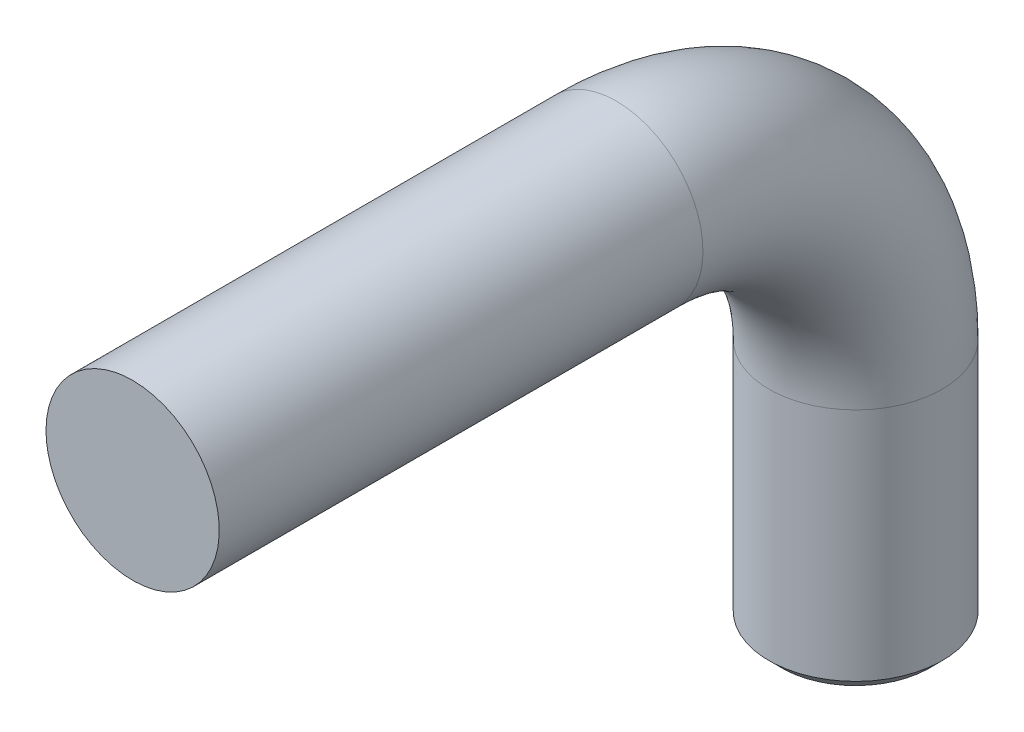
ISO-10303-21;
HEADER;
FILE_DESCRIPTION(('STEP AP214'),'2;1');
FILE_NAME('part.step','',(''),(''),'','','');
FILE_SCHEMA(('AUTOMOTIVE_DESIGN { 1 0 10303 214 1 1 1 1 }'));
ENDSEC;
DATA;
#1=APPLICATION_CONTEXT('core data for automotive mechanical design processes');
#2=APPLICATION_PROTOCOL_DEFINITION('international standard','automotive_design',2000,#1);
#3=PRODUCT_CONTEXT('',#1,'mechanical');
#4=PRODUCT('Part','Part','',(#3));
#5=PRODUCT_RELATED_PRODUCT_CATEGORY('part','',(#4));
#6=PRODUCT_DEFINITION_FORMATION('','',#4);
#7=PRODUCT_DEFINITION_CONTEXT('part definition',#1,'design');
#8=PRODUCT_DEFINITION('design','',#6,#7);
#9=PRODUCT_DEFINITION_SHAPE('','',#8);
#10=(LENGTH_UNIT() NAMED_UNIT(*) SI_UNIT(.MILLI.,.METRE.));
#11=(NAMED_UNIT(*) PLANE_ANGLE_UNIT() SI_UNIT($,.RADIAN.));
#12=(NAMED_UNIT(*) SI_UNIT($,.STERADIAN.) SOLID_ANGLE_UNIT());
#13=UNCERTAINTY_MEASURE_WITH_UNIT(LENGTH_MEASURE(1.E-05),#10,'distance_accuracy_value','');
#14=(GEOMETRIC_REPRESENTATION_CONTEXT(3) GLOBAL_UNCERTAINTY_ASSIGNED_CONTEXT((#13)) GLOBAL_UNIT_ASSIGNED_CONTEXT((#10,
#11,#12)) REPRESENTATION_CONTEXT('',''));
#15=CARTESIAN_POINT('',(0.,0.,0.));
#16=DIRECTION('',(0.,0.,1.));
#17=DIRECTION('',(1.,0.,0.));
#18=AXIS2_PLACEMENT_3D('',#15,#16,#17);
#19=CARTESIAN_POINT('',(-6.072,-39.336531538,-52.354709774));
#20=DIRECTION('',(0.,1.,0.));
#21=DIRECTION('',(0.,0.,-1.));
#22=AXIS2_PLACEMENT_3D('',#19,#20,#21);
#23=PLANE('',#22);
#24=CARTESIAN_POINT('',(0.,-39.336531538,-58.426709774));
#25=DIRECTION('',(0.,-1.,0.));
#26=DIRECTION('',(0.,0.,-1.));
#27=AXIS2_PLACEMENT_3D('',#24,#25,#26);
#28=CIRCLE('',#27,6.);
#29=CARTESIAN_POINT('',(0.,-39.336531538,-64.426709774));
#30=VERTEX_POINT('',#29);
#31=EDGE_CURVE('E56',#30,#30,#28,.F.);
#32=ORIENTED_EDGE('',*,*,#31,.F.);
#33=EDGE_LOOP('',(#32));
#34=FACE_BOUND('',#33,.T.);
#35=ADVANCED_FACE('F51',(#34),#23,.F.);
#36=CARTESIAN_POINT('',(0.,-39.336531538,-64.426709774));
#37=CARTESIAN_POINT('',(0.,-38.336531538,-65.426709774));
#38=(BOUNDED_CURVE() B_SPLINE_CURVE(1,(#36,#37),.UNSPECIFIED.,.F.,
.F.) B_SPLINE_CURVE_WITH_KNOTS((2,2),(0.,0.999999999999972),
.UNSPECIFIED.) CURVE() GEOMETRIC_REPRESENTATION_ITEM() RATIONAL_B_SPLINE_CURVE((1.,1.)) REPRESENTATION_ITEM(''));
#39=CARTESIAN_POINT('',(0.,-1038.336531539,-58.426709774));
#40=DIRECTION('',(0.,1.,0.));
#41=AXIS1_PLACEMENT('',#39,#40);
#42=SURFACE_OF_REVOLUTION('',#38,#41);
#43=ORIENTED_EDGE('',*,*,#31,.T.);
#44=EDGE_LOOP('',(#43));
#45=FACE_BOUND('',#44,.T.);
#46=CARTESIAN_POINT('',(0.,-38.336531538,-58.426709774));
#47=DIRECTION('',(0.,-1.,0.));
#48=DIRECTION('',(0.,0.,-1.));
#49=AXIS2_PLACEMENT_3D('',#46,#47,#48);
#50=CIRCLE('',#49,7.);
#51=CARTESIAN_POINT('',(0.,-38.336531538,-65.426709774));
#52=VERTEX_POINT('',#51);
#53=EDGE_CURVE('E116',#52,#52,#50,.F.);
#54=ORIENTED_EDGE('',*,*,#53,.F.);
#55=EDGE_LOOP('',(#54));
#56=FACE_BOUND('',#55,.T.);
#57=ADVANCED_FACE('F99',(#45,#56),#42,.T.);
#58=CARTESIAN_POINT('',(0.,-19.336531538,-51.426709774));
#59=CARTESIAN_POINT('',(0.,-38.336531538,-51.426709774));
#60=(BOUNDED_CURVE() B_SPLINE_CURVE(1,(#58,#59),.UNSPECIFIED.,.F.,
.F.) B_SPLINE_CURVE_WITH_KNOTS((2,2),(0.,1.),
.UNSPECIFIED.) CURVE() GEOMETRIC_REPRESENTATION_ITEM() RATIONAL_B_SPLINE_CURVE((1.,1.)) REPRESENTATION_ITEM(''));
#61=CARTESIAN_POINT('',(0.,-19.336531538,-58.426709774));
#62=DIRECTION('',(0.,-1.,0.));
#63=AXIS1_PLACEMENT('',#61,#62);
#64=SURFACE_OF_REVOLUTION('',#60,#63);
#65=CARTESIAN_POINT('',(0.,-19.336531538,-58.426709774));
#66=DIRECTION('',(0.,-1.,0.));
#67=DIRECTION('',(0.,0.,-1.));
#68=AXIS2_PLACEMENT_3D('',#65,#66,#67);
#69=CIRCLE('',#68,7.);
#70=CARTESIAN_POINT('',(0.,-19.3365315380001,-65.426709774));
#71=VERTEX_POINT('',#70);
#72=EDGE_CURVE('E65',#71,#71,#69,.T.);
#73=ORIENTED_EDGE('',*,*,#72,.T.);
#74=EDGE_LOOP('',(#73));
#75=FACE_BOUND('',#74,.T.);
#76=ORIENTED_EDGE('',*,*,#53,.T.);
#77=EDGE_LOOP('',(#76));
#78=FACE_BOUND('',#77,.T.);
#79=ADVANCED_FACE('F83',(#75,#78),#64,.T.);
#80=CARTESIAN_POINT('',(0.,-19.3365315379999,-39.090178236));
#81=DIRECTION('',(1.,0.,0.));
#82=DIRECTION('',(0.,0.,1.));
#83=AXIS2_PLACEMENT_3D('',#80,#81,#82);
#84=TOROIDAL_SURFACE('',#83,19.3365315379999,7.);
#85=CARTESIAN_POINT('',(0.,0.,-39.090178236));
#86=DIRECTION('',(0.,0.,-1.));
#87=DIRECTION('',(0.,1.,0.));
#88=AXIS2_PLACEMENT_3D('',#85,#86,#87);
#89=CIRCLE('',#88,7.);
#90=CARTESIAN_POINT('',(0.,7.,-39.090178236));
#91=VERTEX_POINT('',#90);
#92=EDGE_CURVE('E60',#91,#91,#89,.F.);
#93=CARTESIAN_POINT('',(0.,-19.3365315379999,-39.090178236));
#94=DIRECTION('',(1.,0.,0.));
#95=DIRECTION('',(0.,0.,1.));
#96=AXIS2_PLACEMENT_3D('',#93,#94,#95);
#97=CIRCLE('',#96,26.3365315379999);
#98=EDGE_CURVE('',#71,#91,#97,.T.);
#99=ORIENTED_EDGE('',*,*,#72,.F.);
#100=ORIENTED_EDGE('',*,*,#92,.F.);
#101=ORIENTED_EDGE('',*,*,#98,.T.);
#102=ORIENTED_EDGE('',*,*,#98,.F.);
#103=EDGE_LOOP('',(#99,#101,#100,#102));
#104=FACE_BOUND('',#103,.T.);
#105=ADVANCED_FACE('F98',(#104),#84,.T.);
#106=CARTESIAN_POINT('',(7.084,-7.084,0.));
#107=DIRECTION('',(0.,0.,1.));
#108=DIRECTION('',(-1.,0.,0.));
#109=AXIS2_PLACEMENT_3D('',#106,#107,#108);
#110=PLANE('',#109);
#111=CARTESIAN_POINT('',(-7.,-1.91429941660033E-09,0.));
#112=CARTESIAN_POINT('',(-6.99999891509851,0.196537843364104,0.));
#113=CARTESIAN_POINT('',(-6.99171583277586,0.393111316923906,0.));
#114=CARTESIAN_POINT('',(-6.95863478243086,0.784902996405907,0.));
#115=CARTESIAN_POINT('',(-6.93383193869678,0.980120785012645,0.));
#116=CARTESIAN_POINT('',(-6.86783123658557,1.368089954953,0.));
#117=CARTESIAN_POINT('',(-6.82660735302091,1.56083691741882,0.));
#118=CARTESIAN_POINT('',(-6.7280179483323,1.94232350827592,0.));
#119=CARTESIAN_POINT('',(-6.67063932812044,2.13105975044892,0.));
#120=CARTESIAN_POINT('',(-6.54027609809834,2.50269830515233,0.));
#121=CARTESIAN_POINT('',(-6.46731852835665,2.68561010287559,0.));
#122=CARTESIAN_POINT('',(-6.30622093211251,3.04472057343403,0.));
#123=CARTESIAN_POINT('',(-6.21807404509193,3.22091616867288,0.));
#124=CARTESIAN_POINT('',(-6.02724393962142,3.56526003396931,0.));
#125=CARTESIAN_POINT('',(-5.92456017435632,3.73340800099105,0.));
#126=CARTESIAN_POINT('',(-5.70543879336831,4.06037952617178,0.));
#127=CARTESIAN_POINT('',(-5.58900741164614,4.2192072621471,0.));
#128=CARTESIAN_POINT('',(-5.3431015333083,4.52659138815728,0.));
#129=CARTESIAN_POINT('',(-5.21361865727475,4.67514107487068,0.));
#130=CARTESIAN_POINT('',(-4.94272477354184,4.96066133858248,0.));
#131=CARTESIAN_POINT('',(-4.80132538672348,5.09764294149686,0.));
#132=CARTESIAN_POINT('',(-4.50742847418091,5.35927350480671,0.));
#133=CARTESIAN_POINT('',(-4.35492595010818,5.48391685050972,0.));
#134=CARTESIAN_POINT('',(-4.03992693399899,5.71994163914791,0.));
#135=CARTESIAN_POINT('',(-3.87742813542729,5.83132000379004,0.));
#136=CARTESIAN_POINT('',(-3.54368055722161,6.0399539706526,0.));
#137=CARTESIAN_POINT('',(-3.37243475130826,6.13721432993625,0.));
#138=CARTESIAN_POINT('',(-3.02229506377335,6.31699903732685,0.));
#139=CARTESIAN_POINT('',(-2.84339838718572,6.39951794219541,0.));
#140=CARTESIAN_POINT('',(-2.47935795885249,6.54916017127648,0.));
#141=CARTESIAN_POINT('',(-2.29421661919292,6.61628936359377,0.));
#142=CARTESIAN_POINT('',(-1.91886742245351,6.73473767043591,0.));
#143=CARTESIAN_POINT('',(-1.72865769506266,6.78605085832031,0.));
#144=CARTESIAN_POINT('',(-1.3446696181136,6.87245049550629,0.));
#145=CARTESIAN_POINT('',(-1.15089275696516,6.90754356003006,0.));
#146=CARTESIAN_POINT('',(-0.760983453149632,6.96129667140605,0.));
#147=CARTESIAN_POINT('',(-0.564849982830857,6.97994926434688,0.));
#148=CARTESIAN_POINT('',(-0.171708861072429,7.0006616332308,0.));
#149=CARTESIAN_POINT('',(0.0252987903672232,7.00272140917389,0.));
#150=CARTESIAN_POINT('',(0.418697806180248,6.99023635643656,0.));
#151=CARTESIAN_POINT('',(0.61508940928194,6.97569904838587,0.));
#152=CARTESIAN_POINT('',(1.00603037545228,6.93012601343414,0.));
#153=CARTESIAN_POINT('',(1.20057895345833,6.89908355153457,0.));
#154=CARTESIAN_POINT('',(1.58629644040987,6.82073151807987,0.));
#155=CARTESIAN_POINT('',(1.77746658655911,6.77342803688245,0.));
#156=CARTESIAN_POINT('',(2.15521567208457,6.66286647679002,0.));
#157=CARTESIAN_POINT('',(2.3417928293305,6.59960230882084,0.));
#158=CARTESIAN_POINT('',(2.70888540741974,6.4576044887307,0.));
#159=CARTESIAN_POINT('',(2.88940303579749,6.37887654340142,0.));
#160=CARTESIAN_POINT('',(3.24322564239428,6.20646673756665,0.));
#161=CARTESIAN_POINT('',(3.41652816321271,6.11277983386306,0.));
#162=CARTESIAN_POINT('',(3.75458414244703,5.91116079729822,0.));
#163=CARTESIAN_POINT('',(3.9193395711717,5.8032319680526,0.));
#164=CARTESIAN_POINT('',(4.23910084322866,5.57393156301064,0.));
#165=CARTESIAN_POINT('',(4.39411106726421,5.45256609603564,0.));
#166=CARTESIAN_POINT('',(4.69350691037047,5.19709115330211,0.));
#167=CARTESIAN_POINT('',(4.83788213146208,5.06296949157914,0.));
#168=CARTESIAN_POINT('',(5.11472568875869,4.78312605908963,0.));
#169=CARTESIAN_POINT('',(5.24720165362922,4.63741183501937,0.));
#170=CARTESIAN_POINT('',(5.49946717453756,4.33527500368971,0.));
#171=CARTESIAN_POINT('',(5.61925097007774,4.17884758669209,0.));
#172=CARTESIAN_POINT('',(5.84520726613122,3.8564618255379,0.));
#173=CARTESIAN_POINT('',(5.95138027859047,3.69050384019726,0.));
#174=CARTESIAN_POINT('',(6.14932029190583,3.35030901850081,0.));
#175=CARTESIAN_POINT('',(6.24109379191638,3.17607596358646,0.));
#176=CARTESIAN_POINT('',(6.40978599467957,2.82019293812676,0.));
#177=CARTESIAN_POINT('',(6.48667880373029,2.63853069360937,0.));
#178=CARTESIAN_POINT('',(6.62480787986965,2.26951545267121,0.));
#179=CARTESIAN_POINT('',(6.68605681771731,2.08216720013533,0.));
#180=CARTESIAN_POINT('',(6.79245876905863,1.70328094510092,0.));
#181=CARTESIAN_POINT('',(6.8376371993455,1.51175007165545,0.));
#182=CARTESIAN_POINT('',(6.91170339676888,1.12560337103086,0.));
#183=CARTESIAN_POINT('',(6.94059596877539,0.930988471181961,0.));
#184=CARTESIAN_POINT('',(6.97415548049398,0.613393017569112,0.));
#185=CARTESIAN_POINT('',(6.98384414946197,0.490921235047914,0.));
#186=CARTESIAN_POINT('',(6.99676674823848,0.245637606525264,0.));
#187=CARTESIAN_POINT('',(7.00000067804701,0.122825760523812,0.));
#188=CARTESIAN_POINT('',(6.999998915033,-0.196537845698365,0.));
#189=CARTESIAN_POINT('',(6.99171583264476,-0.393111319255953,0.));
#190=CARTESIAN_POINT('',(6.95863478216895,-0.784902998727887,0.));
#191=CARTESIAN_POINT('',(6.93383193836967,-0.980120787326772,0.));
#192=CARTESIAN_POINT('',(6.867831236129,-1.36808995724492,0.));
#193=CARTESIAN_POINT('',(6.82660735250015,-1.56083691969639,0.));
#194=CARTESIAN_POINT('',(6.72801794768457,-1.94232351051955,0.));
#195=CARTESIAN_POINT('',(6.67063932740992,-2.13105975267294,0.));
#196=CARTESIAN_POINT('',(6.5402760972641,-2.50269830733243,0.));
#197=CARTESIAN_POINT('',(6.46731852746144,-2.68561010503139,0.));
#198=CARTESIAN_POINT('',(6.30622093109758,-3.04472057553615,0.));
#199=CARTESIAN_POINT('',(6.21807404401826,-3.22091617074562,0.));
#200=CARTESIAN_POINT('',(6.02724393843297,-3.56526003597845,0.));
#201=CARTESIAN_POINT('',(5.92456017311182,-3.73340800296595,0.));
#202=CARTESIAN_POINT('',(5.70543879201484,-4.06037952807361,0.));
#203=CARTESIAN_POINT('',(5.58900741023973,-4.21920726401011,0.));
#204=CARTESIAN_POINT('',(5.34310153179942,-4.52659138993833,0.));
#205=CARTESIAN_POINT('',(5.21361865571633,-4.6751410766086,0.));
#206=CARTESIAN_POINT('',(4.9427247718882,-4.96066134023014,0.));
#207=CARTESIAN_POINT('',(4.80132538502416,-5.09764294309741,0.));
#208=CARTESIAN_POINT('',(4.50742847239436,-5.35927350630929,0.));
#209=CARTESIAN_POINT('',(4.35492594828011,-5.48391685196144,0.));
#210=CARTESIAN_POINT('',(4.03992693209229,-5.71994164049459,0.));
#211=CARTESIAN_POINT('',(3.87742813348349,-5.83132000508253,0.));
#212=CARTESIAN_POINT('',(3.5436805552083,-6.03995397183382,0.));
#213=CARTESIAN_POINT('',(3.37243474926254,-6.13721433106039,0.));
#214=CARTESIAN_POINT('',(3.02229506166771,-6.31699903833427,0.));
#215=CARTESIAN_POINT('',(2.84339838505258,-6.39951794314319,0.));
#216=CARTESIAN_POINT('',(2.47935795666947,-6.54916017210292,0.));
#217=CARTESIAN_POINT('',(2.29421661698751,-6.61628936435851,0.));
#218=CARTESIAN_POINT('',(1.91886742020861,-6.73473767107553,0.));
#219=CARTESIAN_POINT('',(1.72865769280065,-6.78605085889653,0.));
#220=CARTESIAN_POINT('',(1.34466961582279,-6.87245049595451,0.));
#221=CARTESIAN_POINT('',(1.15089275466264,-6.90754356041369,0.));
#222=CARTESIAN_POINT('',(0.760983450829197,-6.96129667165971,0.));
#223=CARTESIAN_POINT('',(0.564849980504203,-6.97994926453516,0.));
#224=CARTESIAN_POINT('',(0.171708858738871,-7.00066163328804,0.));
#225=CARTESIAN_POINT('',(-0.0252987927014662,-7.00272140916546,0.));
#226=CARTESIAN_POINT('',(-0.418697808510325,-6.99023635629699,0.));
#227=CARTESIAN_POINT('',(-0.61508941160717,-6.97569904818084,0.));
#228=CARTESIAN_POINT('',(-1.00603037776231,-6.9301260130988,0.));
#229=CARTESIAN_POINT('',(-1.20057895575801,-6.89908355113438,0.));
#230=CARTESIAN_POINT('',(-1.58629644268342,-6.82073151755111,0.));
#231=CARTESIAN_POINT('',(-1.77746658881689,-6.77342803628997,0.));
#232=CARTESIAN_POINT('',(-2.1552156743055,-6.66286647607163,0.));
#233=CARTESIAN_POINT('',(-2.34179283153034,-6.59960230804025,0.));
#234=CARTESIAN_POINT('',(-2.70888540957226,-6.45760448782775,0.));
#235=CARTESIAN_POINT('',(-2.88940303792377,-6.37887654243829,0.));
#236=CARTESIAN_POINT('',(-3.24322564446312,-6.20646673648556,0.));
#237=CARTESIAN_POINT('',(-3.41652816525035,-6.11277983272419,0.));
#238=CARTESIAN_POINT('',(-3.75458414441752,-5.91116079604663,0.));
#239=CARTESIAN_POINT('',(-3.91933957310624,-5.80323196674606,0.));
#240=CARTESIAN_POINT('',(-4.23910084508675,-5.57393156159751,0.));
#241=CARTESIAN_POINT('',(-4.39411106908182,-5.45256609457086,0.));
#242=CARTESIAN_POINT('',(-4.69350691210287,-5.19709115173757,0.));
#243=CARTESIAN_POINT('',(-4.83788213314975,-5.0629694899665,0.));
#244=CARTESIAN_POINT('',(-5.11472569035307,-4.78312605738471,0.));
#245=CARTESIAN_POINT('',(-5.24720165517504,-4.63741183327029,0.));
#246=CARTESIAN_POINT('',(-5.49946717598268,-4.33527500185652,0.));
#247=CARTESIAN_POINT('',(-5.61925097147072,-4.17884758481897,0.));
#248=CARTESIAN_POINT('',(-5.84520726741674,-3.85646182358945,0.));
#249=CARTESIAN_POINT('',(-5.95138027982066,-3.69050383821343,0.));
#250=CARTESIAN_POINT('',(-6.1493202930226,-3.35030901645102,0.));
#251=CARTESIAN_POINT('',(-6.24109379297507,-3.17607596150609,0.));
#252=CARTESIAN_POINT('',(-6.40978599561984,-2.82019293598972,0.));
#253=CARTESIAN_POINT('',(-6.48667880461019,-2.63853069144623,0.));
#254=CARTESIAN_POINT('',(-6.62480788062685,-2.26951545046096,0.));
#255=CARTESIAN_POINT('',(-6.68605681841218,-2.08216719790408,0.));
#256=CARTESIAN_POINT('',(-6.79245876962708,-1.70328094283398,0.));
#257=CARTESIAN_POINT('',(-6.83763719984994,-1.51175006937385,0.));
#258=CARTESIAN_POINT('',(-6.9117033971443,-1.1256033687255,0.));
#259=CARTESIAN_POINT('',(-6.94059596908581,-0.930988468867508,0.));
#260=CARTESIAN_POINT('',(-6.97415548061672,-0.613393016017886,0.));
#261=CARTESIAN_POINT('',(-6.98384414950289,-0.490921234271224,0.));
#262=CARTESIAN_POINT('',(-6.99676674819756,-0.245637607301956,0.));
#263=CARTESIAN_POINT('',(-7.00000067800606,-0.12282576207935,0.));
#264=CARTESIAN_POINT('',(-7.,-1.91429941660033E-09,0.));
#265=B_SPLINE_CURVE_WITH_KNOTS('',3,(#111,#112,#113,#114,#115,#116,#117,#118,#119,#120,#121,
#122,#123,#124,#125,#126,#127,#128,#129,#130,#131,#132,#133,#134,#135,#136,#137,#138,#139,#140,
#141,#142,#143,#144,#145,#146,#147,#148,#149,#150,#151,#152,#153,#154,#155,#156,#157,#158,#159,
#160,#161,#162,#163,#164,#165,#166,#167,#168,#169,#170,#171,#172,#173,#174,#175,#176,#177,#178,
#179,#180,#181,#182,#183,#184,#185,#186,#187,#188,#189,#190,#191,#192,#193,#194,#195,#196,#197,
#198,#199,#200,#201,#202,#203,#204,#205,#206,#207,#208,#209,#210,#211,#212,#213,#214,#215,#216,
#217,#218,#219,#220,#221,#222,#223,#224,#225,#226,#227,#228,#229,#230,#231,#232,#233,#234,#235,
#236,#237,#238,#239,#240,#241,#242,#243,#244,#245,#246,#247,#248,#249,#250,#251,#252,#253,#254,
#255,#256,#257,#258,#259,#260,#261,#262,#263,#264),.UNSPECIFIED.,.T.,.F.,(4,2,2,2,2,2,2,2,2,2,2,
2,2,2,2,2,2,2,2,2,2,2,2,2,2,2,2,2,2,2,2,2,2,2,2,2,2,2,2,2,2,2,2,2,2,2,2,2,2,2,2,2,2,2,2,2,2,2,2,
2,2,2,2,2,2,2,2,2,2,2,2,2,2,2,2,2,4),(0.,0.58950107109514,1.17917620715641,1.76978964293131,
2.36088336442639,2.95095935678712,3.54130256912935,4.13166799356071,4.72176673135701,
5.31224677154243,5.90215750003368,6.49233545313817,7.08265009813346,7.67276537252193,
8.26309809685945,8.85320535127168,9.44353346509982,10.0336206063469,10.6239751485653,
11.2143296907838,11.8044168320308,12.394744945859,12.9848522002713,13.5751849246088,
14.1653001989972,14.7556148439924,15.3457927970968,15.9357035255881,16.5261835657737,
17.1162823035699,17.7066477280012,18.2969909403435,18.8870669327043,19.4781606541979,
20.068774089971,20.6584492260334,21.2479502971307,21.6163572954431,21.9847642937554,
22.5742653648527,23.1639405009151,23.7545539366883,24.3456476581818,24.9357236505426,
25.5260668628849,26.1164322873162,26.7065310251125,27.297011065298,27.8869217937893,
28.4770997468937,29.0674143918889,29.6575296662774,30.2478623906149,30.8379696450271,
31.4282977588553,32.0183849001023,32.6087394423208,33.1990939845392,33.7891811257863,
34.3795092396144,34.9696164940267,35.5599492183642,36.1500644927527,36.740379137748,
37.3305570908524,37.9204678193437,38.5109478595291,39.1010465973254,39.6914120217568,
40.281755234099,40.8718312264597,41.4629249479548,42.0535383837297,42.643213519791,
43.2327145908861,43.601121586866,43.9695285828458),.UNSPECIFIED.);
#266=CARTESIAN_POINT('',(-7.,-1.91429941660033E-09,0.));
#267=VERTEX_POINT('',#266);
#268=EDGE_CURVE('E10',#267,#267,#265,.T.);
#269=ORIENTED_EDGE('',*,*,#268,.F.);
#270=EDGE_LOOP('',(#269));
#271=FACE_BOUND('',#270,.T.);
#272=ADVANCED_FACE('F53',(#271),#110,.T.);
#273=CARTESIAN_POINT('',(7.,0.,0.));
#274=CARTESIAN_POINT('',(7.,0.,-39.090178236));
#275=(BOUNDED_CURVE() B_SPLINE_CURVE(1,(#273,#274),.UNSPECIFIED.,.F.,
.F.) B_SPLINE_CURVE_WITH_KNOTS((2,2),(0.,1.),
.UNSPECIFIED.) CURVE() GEOMETRIC_REPRESENTATION_ITEM() RATIONAL_B_SPLINE_CURVE((1.,1.)) REPRESENTATION_ITEM(''));
#276=CARTESIAN_POINT('',(0.,0.,0.));
#277=DIRECTION('',(0.,0.,-1.));
#278=AXIS1_PLACEMENT('',#276,#277);
#279=SURFACE_OF_REVOLUTION('',#275,#278);
#280=ORIENTED_EDGE('',*,*,#92,.T.);
#281=EDGE_LOOP('',(#280));
#282=FACE_BOUND('',#281,.T.);
#283=ORIENTED_EDGE('',*,*,#268,.T.);
#284=EDGE_LOOP('',(#283));
#285=FACE_BOUND('',#284,.T.);
#286=ADVANCED_FACE('F77',(#282,#285),#279,.T.);
#287=CLOSED_SHELL('',(#35,#57,#79,#105,#272,#286));
#288=MANIFOLD_SOLID_BREP('B2',#287);
#289=ADVANCED_BREP_SHAPE_REPRESENTATION('',(#18,#288),#14);
#290=SHAPE_DEFINITION_REPRESENTATION(#9,#289);
ENDSEC;
END-ISO-10303-21;
